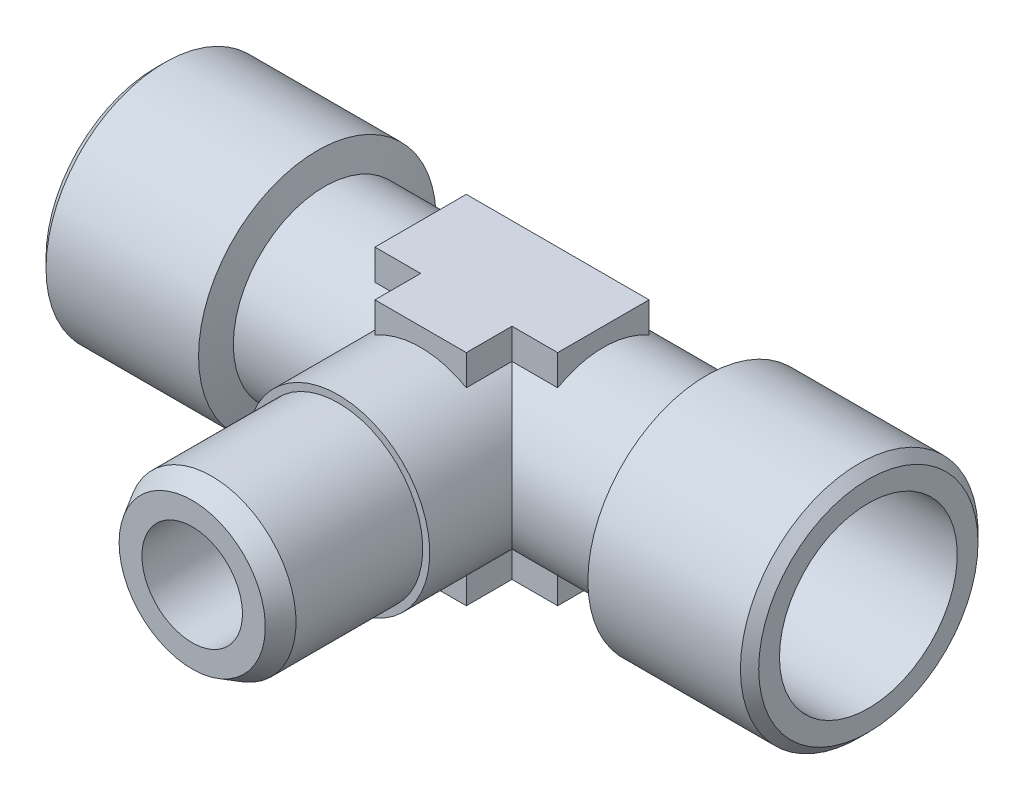
ISO-10303-21;
HEADER;
FILE_DESCRIPTION(('STEP AP214'),'2;1');
FILE_NAME('part.step','',(''),(''),'','','');
FILE_SCHEMA(('AUTOMOTIVE_DESIGN { 1 0 10303 214 1 1 1 1 }'));
ENDSEC;
DATA;
#1=APPLICATION_CONTEXT('core data for automotive mechanical design processes');
#2=APPLICATION_PROTOCOL_DEFINITION('international standard','automotive_design',2000,#1);
#3=PRODUCT_CONTEXT('',#1,'mechanical');
#4=PRODUCT('Part','Part','',(#3));
#5=PRODUCT_RELATED_PRODUCT_CATEGORY('part','',(#4));
#6=PRODUCT_DEFINITION_FORMATION('','',#4);
#7=PRODUCT_DEFINITION_CONTEXT('part definition',#1,'design');
#8=PRODUCT_DEFINITION('design','',#6,#7);
#9=PRODUCT_DEFINITION_SHAPE('','',#8);
#10=(LENGTH_UNIT() NAMED_UNIT(*) SI_UNIT(.MILLI.,.METRE.));
#11=(NAMED_UNIT(*) PLANE_ANGLE_UNIT() SI_UNIT($,.RADIAN.));
#12=(NAMED_UNIT(*) SI_UNIT($,.STERADIAN.) SOLID_ANGLE_UNIT());
#13=UNCERTAINTY_MEASURE_WITH_UNIT(LENGTH_MEASURE(1.E-05),#10,'distance_accuracy_value','');
#14=(GEOMETRIC_REPRESENTATION_CONTEXT(3) GLOBAL_UNCERTAINTY_ASSIGNED_CONTEXT((#13)) GLOBAL_UNIT_ASSIGNED_CONTEXT((#10,
#11,#12)) REPRESENTATION_CONTEXT('',''));
#15=CARTESIAN_POINT('',(0.,0.,0.));
#16=DIRECTION('',(0.,0.,1.));
#17=DIRECTION('',(1.,0.,0.));
#18=AXIS2_PLACEMENT_3D('',#15,#16,#17);
#19=CARTESIAN_POINT('',(-19.5,0.,-5.99999999999999));
#20=DIRECTION('',(1.,0.,0.));
#21=DIRECTION('',(0.,0.,-1.));
#22=AXIS2_PLACEMENT_3D('',#19,#20,#21);
#23=PLANE('',#22);
#24=CARTESIAN_POINT('',(-19.5,0.,0.));
#25=DIRECTION('',(-1.,0.,0.));
#26=DIRECTION('',(0.,0.,1.));
#27=AXIS2_PLACEMENT_3D('',#24,#25,#26);
#28=CIRCLE('',#27,5.99999999999999);
#29=CARTESIAN_POINT('',(-19.5,0.,5.99999999999999));
#30=VERTEX_POINT('',#29);
#31=EDGE_CURVE('E201',#30,#30,#28,.T.);
#32=ORIENTED_EDGE('',*,*,#31,.T.);
#33=EDGE_LOOP('',(#32));
#34=FACE_BOUND('',#33,.T.);
#35=CARTESIAN_POINT('',(-19.5,0.,0.));
#36=DIRECTION('',(-1.,0.,0.));
#37=DIRECTION('',(0.,0.,1.));
#38=AXIS2_PLACEMENT_3D('',#35,#36,#37);
#39=CIRCLE('',#38,4.865);
#40=CARTESIAN_POINT('',(-19.5,0.,4.865));
#41=VERTEX_POINT('',#40);
#42=EDGE_CURVE('E321',#41,#41,#39,.T.);
#43=ORIENTED_EDGE('',*,*,#42,.F.);
#44=EDGE_LOOP('',(#43));
#45=FACE_BOUND('',#44,.T.);
#46=ADVANCED_FACE('F16',(#34,#45),#23,.F.);
#47=CARTESIAN_POINT('',(19.5,0.,-6.));
#48=DIRECTION('',(-1.,0.,0.));
#49=DIRECTION('',(0.,0.,1.));
#50=AXIS2_PLACEMENT_3D('',#47,#48,#49);
#51=PLANE('',#50);
#52=CARTESIAN_POINT('',(19.5,0.,0.));
#53=DIRECTION('',(-1.,0.,0.));
#54=DIRECTION('',(0.,0.,1.));
#55=AXIS2_PLACEMENT_3D('',#52,#53,#54);
#56=CIRCLE('',#55,6.);
#57=CARTESIAN_POINT('',(19.5,0.,6.));
#58=VERTEX_POINT('',#57);
#59=EDGE_CURVE('E198',#58,#58,#56,.T.);
#60=ORIENTED_EDGE('',*,*,#59,.F.);
#61=EDGE_LOOP('',(#60));
#62=FACE_BOUND('',#61,.T.);
#63=CARTESIAN_POINT('',(19.5,0.,0.));
#64=DIRECTION('',(-1.,0.,0.));
#65=DIRECTION('',(0.,0.,1.));
#66=AXIS2_PLACEMENT_3D('',#63,#64,#65);
#67=CIRCLE('',#66,4.865);
#68=CARTESIAN_POINT('',(19.5,0.,4.865));
#69=VERTEX_POINT('',#68);
#70=EDGE_CURVE('E348',#69,#69,#67,.T.);
#71=ORIENTED_EDGE('',*,*,#70,.T.);
#72=EDGE_LOOP('',(#71));
#73=FACE_BOUND('',#72,.T.);
#74=ADVANCED_FACE('F381',(#62,#73),#51,.F.);
#75=CARTESIAN_POINT('',(0.,0.,0.));
#76=DIRECTION('',(-1.,0.,0.));
#77=DIRECTION('',(0.,0.,1.));
#78=AXIS2_PLACEMENT_3D('',#75,#76,#77);
#79=CYLINDRICAL_SURFACE('',#78,5.);
#80=CARTESIAN_POINT('',(-10.25,0.,0.));
#81=DIRECTION('',(-1.,0.,0.));
#82=DIRECTION('',(0.,0.,1.));
#83=AXIS2_PLACEMENT_3D('',#80,#81,#82);
#84=CIRCLE('',#83,5.);
#85=CARTESIAN_POINT('',(-10.25,0.,5.));
#86=VERTEX_POINT('',#85);
#87=EDGE_CURVE('E186',#86,#86,#84,.T.);
#88=ORIENTED_EDGE('',*,*,#87,.F.);
#89=EDGE_LOOP('',(#88));
#90=FACE_BOUND('',#89,.T.);
#91=CARTESIAN_POINT('',(10.25,0.,0.));
#92=DIRECTION('',(-1.,0.,0.));
#93=DIRECTION('',(0.,0.,1.));
#94=AXIS2_PLACEMENT_3D('',#91,#92,#93);
#95=CIRCLE('',#94,5.);
#96=CARTESIAN_POINT('',(10.25,0.,5.));
#97=VERTEX_POINT('',#96);
#98=EDGE_CURVE('E189',#97,#97,#95,.T.);
#99=ORIENTED_EDGE('',*,*,#98,.T.);
#100=EDGE_LOOP('',(#99));
#101=FACE_BOUND('',#100,.T.);
#102=DIRECTION('',(-1.,0.,0.));
#103=VECTOR('',#102,1.);
#104=CARTESIAN_POINT('',(0.,-4.33012701892219,2.5));
#105=LINE('',#104,#103);
#106=CARTESIAN_POINT('',(-2.5,-4.33012701892219,2.5));
#107=VERTEX_POINT('',#106);
#108=CARTESIAN_POINT('',(-5.,-4.33012701892219,2.5));
#109=VERTEX_POINT('',#108);
#110=EDGE_CURVE('E172',#107,#109,#105,.T.);
#111=ORIENTED_EDGE('',*,*,#110,.F.);
#112=CARTESIAN_POINT('',(0.,0.,0.));
#113=DIRECTION('',(-0.707106781186547,0.,-0.707106781186547));
#114=DIRECTION('',(-0.707106781186547,0.,0.707106781186547));
#115=AXIS2_PLACEMENT_3D('',#112,#113,#114);
#116=ELLIPSE('',#115,7.07106781186547,5.);
#117=CARTESIAN_POINT('',(-2.5,4.33012701892219,2.5));
#118=VERTEX_POINT('',#117);
#119=EDGE_CURVE('E213',#107,#118,#116,.T.);
#120=ORIENTED_EDGE('',*,*,#119,.T.);
#121=DIRECTION('',(-1.,0.,0.));
#122=VECTOR('',#121,1.);
#123=CARTESIAN_POINT('',(0.,4.33012701892219,2.5));
#124=LINE('',#123,#122);
#125=CARTESIAN_POINT('',(-5.,4.33012701892219,2.5));
#126=VERTEX_POINT('',#125);
#127=EDGE_CURVE('E170',#126,#118,#124,.F.);
#128=ORIENTED_EDGE('',*,*,#127,.F.);
#129=CARTESIAN_POINT('',(-5.,0.,0.));
#130=DIRECTION('',(1.,0.,0.));
#131=DIRECTION('',(0.,0.,-1.));
#132=AXIS2_PLACEMENT_3D('',#129,#130,#131);
#133=CIRCLE('',#132,5.);
#134=CARTESIAN_POINT('',(-5.,4.33012701892219,-2.5));
#135=VERTEX_POINT('',#134);
#136=EDGE_CURVE('E31',#135,#126,#133,.T.);
#137=ORIENTED_EDGE('',*,*,#136,.F.);
#138=DIRECTION('',(-1.,0.,0.));
#139=VECTOR('',#138,1.);
#140=CARTESIAN_POINT('',(0.,4.33012701892219,-2.5));
#141=LINE('',#140,#139);
#142=CARTESIAN_POINT('',(5.,4.33012701892219,-2.5));
#143=VERTEX_POINT('',#142);
#144=EDGE_CURVE('E233',#143,#135,#141,.T.);
#145=ORIENTED_EDGE('',*,*,#144,.F.);
#146=CARTESIAN_POINT('',(5.,0.,0.));
#147=DIRECTION('',(-1.,0.,0.));
#148=DIRECTION('',(0.,0.,1.));
#149=AXIS2_PLACEMENT_3D('',#146,#147,#148);
#150=CIRCLE('',#149,5.);
#151=CARTESIAN_POINT('',(5.,4.33012701892219,2.5));
#152=VERTEX_POINT('',#151);
#153=EDGE_CURVE('E160',#152,#143,#150,.T.);
#154=ORIENTED_EDGE('',*,*,#153,.F.);
#155=DIRECTION('',(-1.,0.,0.));
#156=VECTOR('',#155,1.);
#157=CARTESIAN_POINT('',(0.,4.33012701892219,2.5));
#158=LINE('',#157,#156);
#159=CARTESIAN_POINT('',(2.5,4.33012701892219,2.5));
#160=VERTEX_POINT('',#159);
#161=EDGE_CURVE('E161',#160,#152,#158,.F.);
#162=ORIENTED_EDGE('',*,*,#161,.F.);
#163=CARTESIAN_POINT('',(0.,0.,0.));
#164=DIRECTION('',(-0.707106781186547,0.,0.707106781186547));
#165=DIRECTION('',(-0.707106781186547,0.,-0.707106781186547));
#166=AXIS2_PLACEMENT_3D('',#163,#164,#165);
#167=ELLIPSE('',#166,7.07106781186547,5.);
#168=CARTESIAN_POINT('',(2.5,-4.33012701892219,2.5));
#169=VERTEX_POINT('',#168);
#170=EDGE_CURVE('E210',#160,#169,#167,.F.);
#171=ORIENTED_EDGE('',*,*,#170,.T.);
#172=DIRECTION('',(-1.,0.,0.));
#173=VECTOR('',#172,1.);
#174=CARTESIAN_POINT('',(0.,-4.33012701892219,2.5));
#175=LINE('',#174,#173);
#176=CARTESIAN_POINT('',(5.,-4.33012701892219,2.5));
#177=VERTEX_POINT('',#176);
#178=EDGE_CURVE('E164',#177,#169,#175,.T.);
#179=ORIENTED_EDGE('',*,*,#178,.F.);
#180=CARTESIAN_POINT('',(5.,-4.33012701892219,-2.5));
#181=VERTEX_POINT('',#180);
#182=EDGE_CURVE('E234',#181,#177,#150,.T.);
#183=ORIENTED_EDGE('',*,*,#182,.F.);
#184=DIRECTION('',(-1.,0.,0.));
#185=VECTOR('',#184,1.);
#186=CARTESIAN_POINT('',(0.,-4.33012701892219,-2.5));
#187=LINE('',#186,#185);
#188=CARTESIAN_POINT('',(-5.,-4.33012701892219,-2.5));
#189=VERTEX_POINT('',#188);
#190=EDGE_CURVE('E29',#189,#181,#187,.F.);
#191=ORIENTED_EDGE('',*,*,#190,.F.);
#192=EDGE_CURVE('E10',#109,#189,#133,.T.);
#193=ORIENTED_EDGE('',*,*,#192,.F.);
#194=EDGE_LOOP('',(#111,#120,#128,#137,#145,#154,#162,#171,#179,#183,#191,#193));
#195=FACE_BOUND('',#194,.T.);
#196=ADVANCED_FACE('F255',(#90,#101,#195),#79,.T.);
#197=CARTESIAN_POINT('',(0.,0.,0.));
#198=DIRECTION('',(0.,0.,-1.));
#199=DIRECTION('',(-1.,0.,0.));
#200=AXIS2_PLACEMENT_3D('',#197,#198,#199);
#201=CYLINDRICAL_SURFACE('',#200,5.);
#202=CARTESIAN_POINT('',(0.,0.,9.5));
#203=DIRECTION('',(0.,0.,-1.));
#204=DIRECTION('',(-1.,0.,0.));
#205=AXIS2_PLACEMENT_3D('',#202,#203,#204);
#206=CIRCLE('',#205,5.);
#207=CARTESIAN_POINT('',(-5.,0.,9.5));
#208=VERTEX_POINT('',#207);
#209=EDGE_CURVE('E183',#208,#208,#206,.T.);
#210=ORIENTED_EDGE('',*,*,#209,.T.);
#211=EDGE_LOOP('',(#210));
#212=FACE_BOUND('',#211,.T.);
#213=CARTESIAN_POINT('',(0.,0.,5.));
#214=DIRECTION('',(0.,0.,-1.));
#215=DIRECTION('',(-1.,0.,0.));
#216=AXIS2_PLACEMENT_3D('',#213,#214,#215);
#217=CIRCLE('',#216,5.);
#218=CARTESIAN_POINT('',(2.5,4.33012701892219,5.));
#219=VERTEX_POINT('',#218);
#220=CARTESIAN_POINT('',(-2.5,4.33012701892219,5.));
#221=VERTEX_POINT('',#220);
#222=EDGE_CURVE('E223',#219,#221,#217,.F.);
#223=ORIENTED_EDGE('',*,*,#222,.T.);
#224=DIRECTION('',(0.,0.,-1.));
#225=VECTOR('',#224,1.);
#226=CARTESIAN_POINT('',(-2.5,4.33012701892219,0.));
#227=LINE('',#226,#225);
#228=EDGE_CURVE('E229',#221,#118,#227,.T.);
#229=ORIENTED_EDGE('',*,*,#228,.T.);
#230=ORIENTED_EDGE('',*,*,#119,.F.);
#231=DIRECTION('',(0.,0.,-1.));
#232=VECTOR('',#231,1.);
#233=CARTESIAN_POINT('',(-2.5,-4.33012701892219,0.));
#234=LINE('',#233,#232);
#235=CARTESIAN_POINT('',(-2.5,-4.33012701892219,5.));
#236=VERTEX_POINT('',#235);
#237=EDGE_CURVE('E222',#107,#236,#234,.F.);
#238=ORIENTED_EDGE('',*,*,#237,.T.);
#239=CARTESIAN_POINT('',(2.5,-4.33012701892219,5.));
#240=VERTEX_POINT('',#239);
#241=EDGE_CURVE('E219',#236,#240,#217,.F.);
#242=ORIENTED_EDGE('',*,*,#241,.T.);
#243=DIRECTION('',(0.,0.,-1.));
#244=VECTOR('',#243,1.);
#245=CARTESIAN_POINT('',(2.5,-4.33012701892219,0.));
#246=LINE('',#245,#244);
#247=EDGE_CURVE('E216',#240,#169,#246,.T.);
#248=ORIENTED_EDGE('',*,*,#247,.T.);
#249=ORIENTED_EDGE('',*,*,#170,.F.);
#250=DIRECTION('',(0.,0.,-1.));
#251=VECTOR('',#250,1.);
#252=CARTESIAN_POINT('',(2.5,4.33012701892219,0.));
#253=LINE('',#252,#251);
#254=EDGE_CURVE('E226',#160,#219,#253,.F.);
#255=ORIENTED_EDGE('',*,*,#254,.T.);
#256=EDGE_LOOP('',(#223,#229,#230,#238,#242,#248,#249,#255));
#257=FACE_BOUND('',#256,.T.);
#258=ADVANCED_FACE('F260',(#212,#257),#201,.T.);
#259=CARTESIAN_POINT('',(-10.25,0.,0.));
#260=DIRECTION('',(-1.,0.,0.));
#261=DIRECTION('',(0.,0.,1.));
#262=AXIS2_PLACEMENT_3D('',#259,#260,#261);
#263=CONICAL_SURFACE('',#262,5.,1.30899693899576);
#264=CARTESIAN_POINT('',(-10.6519237886467,0.,0.));
#265=DIRECTION('',(-1.,0.,0.));
#266=DIRECTION('',(0.,0.,1.));
#267=AXIS2_PLACEMENT_3D('',#264,#265,#266);
#268=CIRCLE('',#267,6.5);
#269=CARTESIAN_POINT('',(-10.6519237886467,0.,6.5));
#270=VERTEX_POINT('',#269);
#271=EDGE_CURVE('E207',#270,#270,#268,.T.);
#272=ORIENTED_EDGE('',*,*,#271,.F.);
#273=EDGE_LOOP('',(#272));
#274=FACE_BOUND('',#273,.T.);
#275=ORIENTED_EDGE('',*,*,#87,.T.);
#276=EDGE_LOOP('',(#275));
#277=FACE_BOUND('',#276,.T.);
#278=ADVANCED_FACE('F18',(#274,#277),#263,.T.);
#279=CARTESIAN_POINT('',(0.,0.,0.));
#280=DIRECTION('',(-1.,0.,0.));
#281=DIRECTION('',(0.,0.,1.));
#282=AXIS2_PLACEMENT_3D('',#279,#280,#281);
#283=CYLINDRICAL_SURFACE('',#282,6.5);
#284=CARTESIAN_POINT('',(-19.,0.,0.));
#285=DIRECTION('',(-1.,0.,0.));
#286=DIRECTION('',(0.,0.,1.));
#287=AXIS2_PLACEMENT_3D('',#284,#285,#286);
#288=CIRCLE('',#287,6.5);
#289=CARTESIAN_POINT('',(-19.,0.,6.5));
#290=VERTEX_POINT('',#289);
#291=EDGE_CURVE('E204',#290,#290,#288,.T.);
#292=ORIENTED_EDGE('',*,*,#291,.F.);
#293=EDGE_LOOP('',(#292));
#294=FACE_BOUND('',#293,.T.);
#295=ORIENTED_EDGE('',*,*,#271,.T.);
#296=EDGE_LOOP('',(#295));
#297=FACE_BOUND('',#296,.T.);
#298=ADVANCED_FACE('F401',(#294,#297),#283,.T.);
#299=CARTESIAN_POINT('',(-19.,0.,0.));
#300=DIRECTION('',(1.,0.,0.));
#301=DIRECTION('',(0.,0.,-1.));
#302=AXIS2_PLACEMENT_3D('',#299,#300,#301);
#303=CONICAL_SURFACE('',#302,6.5,0.785398163397469);
#304=ORIENTED_EDGE('',*,*,#31,.F.);
#305=EDGE_LOOP('',(#304));
#306=FACE_BOUND('',#305,.T.);
#307=ORIENTED_EDGE('',*,*,#291,.T.);
#308=EDGE_LOOP('',(#307));
#309=FACE_BOUND('',#308,.T.);
#310=ADVANCED_FACE('F399',(#306,#309),#303,.T.);
#311=CARTESIAN_POINT('',(19.5,0.,0.));
#312=DIRECTION('',(-1.,0.,0.));
#313=DIRECTION('',(0.,0.,1.));
#314=AXIS2_PLACEMENT_3D('',#311,#312,#313);
#315=CONICAL_SURFACE('',#314,6.,0.785398163397448);
#316=CARTESIAN_POINT('',(19.,0.,0.));
#317=DIRECTION('',(-1.,0.,0.));
#318=DIRECTION('',(0.,0.,1.));
#319=AXIS2_PLACEMENT_3D('',#316,#317,#318);
#320=CIRCLE('',#319,6.5);
#321=CARTESIAN_POINT('',(19.,0.,6.5));
#322=VERTEX_POINT('',#321);
#323=EDGE_CURVE('E195',#322,#322,#320,.T.);
#324=ORIENTED_EDGE('',*,*,#323,.F.);
#325=EDGE_LOOP('',(#324));
#326=FACE_BOUND('',#325,.T.);
#327=ORIENTED_EDGE('',*,*,#59,.T.);
#328=EDGE_LOOP('',(#327));
#329=FACE_BOUND('',#328,.T.);
#330=ADVANCED_FACE('F396',(#326,#329),#315,.T.);
#331=CARTESIAN_POINT('',(0.,0.,0.));
#332=DIRECTION('',(-1.,0.,0.));
#333=DIRECTION('',(0.,0.,1.));
#334=AXIS2_PLACEMENT_3D('',#331,#332,#333);
#335=CYLINDRICAL_SURFACE('',#334,6.5);
#336=CARTESIAN_POINT('',(10.6519237886467,0.,0.));
#337=DIRECTION('',(-1.,0.,0.));
#338=DIRECTION('',(0.,0.,1.));
#339=AXIS2_PLACEMENT_3D('',#336,#337,#338);
#340=CIRCLE('',#339,6.5);
#341=CARTESIAN_POINT('',(10.6519237886467,0.,6.5));
#342=VERTEX_POINT('',#341);
#343=EDGE_CURVE('E192',#342,#342,#340,.T.);
#344=ORIENTED_EDGE('',*,*,#343,.F.);
#345=EDGE_LOOP('',(#344));
#346=FACE_BOUND('',#345,.T.);
#347=ORIENTED_EDGE('',*,*,#323,.T.);
#348=EDGE_LOOP('',(#347));
#349=FACE_BOUND('',#348,.T.);
#350=ADVANCED_FACE('F421',(#346,#349),#335,.T.);
#351=CARTESIAN_POINT('',(10.6519237886467,0.,0.));
#352=DIRECTION('',(1.,0.,0.));
#353=DIRECTION('',(0.,0.,-1.));
#354=AXIS2_PLACEMENT_3D('',#351,#352,#353);
#355=CONICAL_SURFACE('',#354,6.5,1.30899693899576);
#356=ORIENTED_EDGE('',*,*,#98,.F.);
#357=EDGE_LOOP('',(#356));
#358=FACE_BOUND('',#357,.T.);
#359=ORIENTED_EDGE('',*,*,#343,.T.);
#360=EDGE_LOOP('',(#359));
#361=FACE_BOUND('',#360,.T.);
#362=ADVANCED_FACE('F417',(#358,#361),#355,.T.);
#363=CARTESIAN_POINT('',(-5.,0.,9.5));
#364=DIRECTION('',(0.,0.,1.));
#365=DIRECTION('',(1.,0.,0.));
#366=AXIS2_PLACEMENT_3D('',#363,#364,#365);
#367=PLANE('',#366);
#368=CARTESIAN_POINT('',(0.,0.,9.5));
#369=DIRECTION('',(0.,0.,-1.));
#370=DIRECTION('',(-1.,0.,0.));
#371=AXIS2_PLACEMENT_3D('',#368,#369,#370);
#372=CIRCLE('',#371,4.615);
#373=CARTESIAN_POINT('',(-4.615,0.,9.5));
#374=VERTEX_POINT('',#373);
#375=EDGE_CURVE('E180',#374,#374,#372,.T.);
#376=ORIENTED_EDGE('',*,*,#375,.T.);
#377=EDGE_LOOP('',(#376));
#378=FACE_BOUND('',#377,.T.);
#379=ORIENTED_EDGE('',*,*,#209,.F.);
#380=EDGE_LOOP('',(#379));
#381=FACE_BOUND('',#380,.T.);
#382=ADVANCED_FACE('F420',(#378,#381),#367,.T.);
#383=CARTESIAN_POINT('',(0.,0.,0.));
#384=DIRECTION('',(0.,0.,-1.));
#385=DIRECTION('',(-1.,0.,0.));
#386=AXIS2_PLACEMENT_3D('',#383,#384,#385);
#387=CYLINDRICAL_SURFACE('',#386,4.615);
#388=CARTESIAN_POINT('',(0.,0.,16.4347887533451));
#389=DIRECTION('',(0.,0.,-1.));
#390=DIRECTION('',(-1.,0.,0.));
#391=AXIS2_PLACEMENT_3D('',#388,#389,#390);
#392=CIRCLE('',#391,4.615);
#393=CARTESIAN_POINT('',(-4.615,0.,16.4347887533451));
#394=VERTEX_POINT('',#393);
#395=EDGE_CURVE('E177',#394,#394,#392,.T.);
#396=ORIENTED_EDGE('',*,*,#395,.T.);
#397=EDGE_LOOP('',(#396));
#398=FACE_BOUND('',#397,.T.);
#399=ORIENTED_EDGE('',*,*,#375,.F.);
#400=EDGE_LOOP('',(#399));
#401=FACE_BOUND('',#400,.T.);
#402=ADVANCED_FACE('F454',(#398,#401),#387,.T.);
#403=CARTESIAN_POINT('',(0.,0.,16.4347887533451));
#404=DIRECTION('',(0.,0.,-1.));
#405=DIRECTION('',(-1.,0.,0.));
#406=AXIS2_PLACEMENT_3D('',#403,#404,#405);
#407=CONICAL_SURFACE('',#406,4.615,0.523598775598296);
#408=CARTESIAN_POINT('',(0.,0.,17.5));
#409=DIRECTION('',(0.,0.,-1.));
#410=DIRECTION('',(-1.,0.,0.));
#411=AXIS2_PLACEMENT_3D('',#408,#409,#410);
#412=CIRCLE('',#411,4.);
#413=CARTESIAN_POINT('',(-4.,0.,17.5));
#414=VERTEX_POINT('',#413);
#415=EDGE_CURVE('E174',#414,#414,#412,.T.);
#416=ORIENTED_EDGE('',*,*,#415,.T.);
#417=EDGE_LOOP('',(#416));
#418=FACE_BOUND('',#417,.T.);
#419=ORIENTED_EDGE('',*,*,#395,.F.);
#420=EDGE_LOOP('',(#419));
#421=FACE_BOUND('',#420,.T.);
#422=ADVANCED_FACE('F463',(#418,#421),#407,.T.);
#423=CARTESIAN_POINT('',(-4.,0.,17.5));
#424=DIRECTION('',(0.,0.,1.));
#425=DIRECTION('',(1.,0.,0.));
#426=AXIS2_PLACEMENT_3D('',#423,#424,#425);
#427=PLANE('',#426);
#428=CARTESIAN_POINT('',(0.,0.,17.5));
#429=DIRECTION('',(0.,0.,-1.));
#430=DIRECTION('',(-1.,0.,0.));
#431=AXIS2_PLACEMENT_3D('',#428,#429,#430);
#432=CIRCLE('',#431,2.75);
#433=CARTESIAN_POINT('',(-2.75,0.,17.5));
#434=VERTEX_POINT('',#433);
#435=EDGE_CURVE('E351',#434,#434,#432,.T.);
#436=ORIENTED_EDGE('',*,*,#435,.T.);
#437=EDGE_LOOP('',(#436));
#438=FACE_BOUND('',#437,.T.);
#439=ORIENTED_EDGE('',*,*,#415,.F.);
#440=EDGE_LOOP('',(#439));
#441=FACE_BOUND('',#440,.T.);
#442=ADVANCED_FACE('F472',(#438,#441),#427,.T.);
#443=CARTESIAN_POINT('',(5.,-6.,2.5));
#444=DIRECTION('',(0.,-1.,0.));
#445=DIRECTION('',(0.,0.,-1.));
#446=AXIS2_PLACEMENT_3D('',#443,#444,#445);
#447=PLANE('',#446);
#448=DIRECTION('',(0.,0.,-1.));
#449=VECTOR('',#448,1.);
#450=CARTESIAN_POINT('',(5.,-6.,2.5));
#451=LINE('',#450,#449);
#452=CARTESIAN_POINT('',(5.,-6.,2.5));
#453=VERTEX_POINT('',#452);
#454=CARTESIAN_POINT('',(5.,-6.,-2.5));
#455=VERTEX_POINT('',#454);
#456=EDGE_CURVE('E320',#453,#455,#451,.T.);
#457=ORIENTED_EDGE('',*,*,#456,.F.);
#458=DIRECTION('',(1.,0.,0.));
#459=VECTOR('',#458,1.);
#460=CARTESIAN_POINT('',(2.5,-6.,2.5));
#461=LINE('',#460,#459);
#462=CARTESIAN_POINT('',(2.5,-6.,2.5));
#463=VERTEX_POINT('',#462);
#464=EDGE_CURVE('E156',#463,#453,#461,.T.);
#465=ORIENTED_EDGE('',*,*,#464,.F.);
#466=DIRECTION('',(0.,0.,-1.));
#467=VECTOR('',#466,1.);
#468=CARTESIAN_POINT('',(2.5,-6.,5.));
#469=LINE('',#468,#467);
#470=CARTESIAN_POINT('',(2.5,-6.,5.));
#471=VERTEX_POINT('',#470);
#472=EDGE_CURVE('E318',#471,#463,#469,.T.);
#473=ORIENTED_EDGE('',*,*,#472,.F.);
#474=DIRECTION('',(1.,0.,0.));
#475=VECTOR('',#474,1.);
#476=CARTESIAN_POINT('',(-2.5,-6.,5.));
#477=LINE('',#476,#475);
#478=CARTESIAN_POINT('',(-2.5,-6.,5.));
#479=VERTEX_POINT('',#478);
#480=EDGE_CURVE('E269',#479,#471,#477,.T.);
#481=ORIENTED_EDGE('',*,*,#480,.F.);
#482=DIRECTION('',(0.,0.,1.));
#483=VECTOR('',#482,1.);
#484=CARTESIAN_POINT('',(-2.5,-6.,2.5));
#485=LINE('',#484,#483);
#486=CARTESIAN_POINT('',(-2.5,-6.,2.5));
#487=VERTEX_POINT('',#486);
#488=EDGE_CURVE('E312',#487,#479,#485,.T.);
#489=ORIENTED_EDGE('',*,*,#488,.F.);
#490=DIRECTION('',(1.,0.,0.));
#491=VECTOR('',#490,1.);
#492=CARTESIAN_POINT('',(-5.,-6.,2.5));
#493=LINE('',#492,#491);
#494=CARTESIAN_POINT('',(-5.,-6.,2.5));
#495=VERTEX_POINT('',#494);
#496=EDGE_CURVE('E298',#495,#487,#493,.T.);
#497=ORIENTED_EDGE('',*,*,#496,.F.);
#498=DIRECTION('',(0.,0.,1.));
#499=VECTOR('',#498,1.);
#500=CARTESIAN_POINT('',(-5.,-6.,-2.5));
#501=LINE('',#500,#499);
#502=CARTESIAN_POINT('',(-5.,-6.,-2.5));
#503=VERTEX_POINT('',#502);
#504=EDGE_CURVE('E303',#503,#495,#501,.T.);
#505=ORIENTED_EDGE('',*,*,#504,.F.);
#506=DIRECTION('',(-1.,0.,0.));
#507=VECTOR('',#506,1.);
#508=CARTESIAN_POINT('',(5.,-6.,-2.5));
#509=LINE('',#508,#507);
#510=EDGE_CURVE('E308',#455,#503,#509,.T.);
#511=ORIENTED_EDGE('',*,*,#510,.F.);
#512=EDGE_LOOP('',(#457,#465,#473,#481,#489,#497,#505,#511));
#513=FACE_BOUND('',#512,.T.);
#514=ADVANCED_FACE('F310',(#513),#447,.T.);
#515=CARTESIAN_POINT('',(2.5,6.,5.));
#516=DIRECTION('',(-1.,0.,0.));
#517=DIRECTION('',(0.,0.,1.));
#518=AXIS2_PLACEMENT_3D('',#515,#516,#517);
#519=PLANE('',#518);
#520=ORIENTED_EDGE('',*,*,#247,.F.);
#521=DIRECTION('',(0.,-1.,0.));
#522=VECTOR('',#521,1.);
#523=CARTESIAN_POINT('',(2.5,6.,5.));
#524=LINE('',#523,#522);
#525=EDGE_CURVE('E263',#240,#471,#524,.T.);
#526=ORIENTED_EDGE('',*,*,#525,.T.);
#527=ORIENTED_EDGE('',*,*,#472,.T.);
#528=DIRECTION('',(0.,-1.,0.));
#529=VECTOR('',#528,1.);
#530=CARTESIAN_POINT('',(2.5,6.,2.5));
#531=LINE('',#530,#529);
#532=EDGE_CURVE('E46',#169,#463,#531,.T.);
#533=ORIENTED_EDGE('',*,*,#532,.F.);
#534=EDGE_LOOP('',(#520,#526,#527,#533));
#535=FACE_BOUND('',#534,.T.);
#536=ADVANCED_FACE('F262',(#535),#519,.F.);
#537=CARTESIAN_POINT('',(-2.5,6.,5.));
#538=DIRECTION('',(0.,0.,-1.));
#539=DIRECTION('',(-1.,0.,0.));
#540=AXIS2_PLACEMENT_3D('',#537,#538,#539);
#541=PLANE('',#540);
#542=ORIENTED_EDGE('',*,*,#241,.F.);
#543=DIRECTION('',(0.,-1.,0.));
#544=VECTOR('',#543,1.);
#545=CARTESIAN_POINT('',(-2.5,6.,5.));
#546=LINE('',#545,#544);
#547=EDGE_CURVE('E273',#236,#479,#546,.T.);
#548=ORIENTED_EDGE('',*,*,#547,.T.);
#549=ORIENTED_EDGE('',*,*,#480,.T.);
#550=ORIENTED_EDGE('',*,*,#525,.F.);
#551=EDGE_LOOP('',(#542,#548,#549,#550));
#552=FACE_BOUND('',#551,.T.);
#553=ADVANCED_FACE('F266',(#552),#541,.F.);
#554=CARTESIAN_POINT('',(-2.5,6.,2.5));
#555=DIRECTION('',(1.,0.,0.));
#556=DIRECTION('',(0.,0.,-1.));
#557=AXIS2_PLACEMENT_3D('',#554,#555,#556);
#558=PLANE('',#557);
#559=ORIENTED_EDGE('',*,*,#237,.F.);
#560=DIRECTION('',(0.,-1.,0.));
#561=VECTOR('',#560,1.);
#562=CARTESIAN_POINT('',(-2.5,6.,2.5));
#563=LINE('',#562,#561);
#564=EDGE_CURVE('E280',#107,#487,#563,.T.);
#565=ORIENTED_EDGE('',*,*,#564,.T.);
#566=ORIENTED_EDGE('',*,*,#488,.T.);
#567=ORIENTED_EDGE('',*,*,#547,.F.);
#568=EDGE_LOOP('',(#559,#565,#566,#567));
#569=FACE_BOUND('',#568,.T.);
#570=ADVANCED_FACE('F503',(#569),#558,.F.);
#571=CARTESIAN_POINT('',(2.5,6.,2.5));
#572=DIRECTION('',(0.,0.,-1.));
#573=DIRECTION('',(-1.,0.,0.));
#574=AXIS2_PLACEMENT_3D('',#571,#572,#573);
#575=PLANE('',#574);
#576=DIRECTION('',(0.,-1.,0.));
#577=VECTOR('',#576,1.);
#578=CARTESIAN_POINT('',(5.,6.,2.5));
#579=LINE('',#578,#577);
#580=EDGE_CURVE('E244',#177,#453,#579,.T.);
#581=ORIENTED_EDGE('',*,*,#580,.F.);
#582=ORIENTED_EDGE('',*,*,#178,.T.);
#583=ORIENTED_EDGE('',*,*,#532,.T.);
#584=ORIENTED_EDGE('',*,*,#464,.T.);
#585=EDGE_LOOP('',(#581,#582,#583,#584));
#586=FACE_BOUND('',#585,.T.);
#587=ADVANCED_FACE('F249',(#586),#575,.F.);
#588=CARTESIAN_POINT('',(-5.,6.,2.5));
#589=DIRECTION('',(0.,0.,-1.));
#590=DIRECTION('',(-1.,0.,0.));
#591=AXIS2_PLACEMENT_3D('',#588,#589,#590);
#592=PLANE('',#591);
#593=ORIENTED_EDGE('',*,*,#564,.F.);
#594=ORIENTED_EDGE('',*,*,#110,.T.);
#595=DIRECTION('',(0.,-1.,0.));
#596=VECTOR('',#595,1.);
#597=CARTESIAN_POINT('',(-5.,6.,2.5));
#598=LINE('',#597,#596);
#599=EDGE_CURVE('E283',#109,#495,#598,.T.);
#600=ORIENTED_EDGE('',*,*,#599,.T.);
#601=ORIENTED_EDGE('',*,*,#496,.T.);
#602=EDGE_LOOP('',(#593,#594,#600,#601));
#603=FACE_BOUND('',#602,.T.);
#604=ADVANCED_FACE('F296',(#603),#592,.F.);
#605=CARTESIAN_POINT('',(-5.,6.,-2.5));
#606=DIRECTION('',(1.,0.,0.));
#607=DIRECTION('',(0.,0.,-1.));
#608=AXIS2_PLACEMENT_3D('',#605,#606,#607);
#609=PLANE('',#608);
#610=ORIENTED_EDGE('',*,*,#599,.F.);
#611=ORIENTED_EDGE('',*,*,#192,.T.);
#612=DIRECTION('',(0.,-1.,0.));
#613=VECTOR('',#612,1.);
#614=CARTESIAN_POINT('',(-5.,6.,-2.5));
#615=LINE('',#614,#613);
#616=EDGE_CURVE('E286',#189,#503,#615,.T.);
#617=ORIENTED_EDGE('',*,*,#616,.T.);
#618=ORIENTED_EDGE('',*,*,#504,.T.);
#619=EDGE_LOOP('',(#610,#611,#617,#618));
#620=FACE_BOUND('',#619,.T.);
#621=ADVANCED_FACE('F304',(#620),#609,.F.);
#622=CARTESIAN_POINT('',(5.,6.,-2.5));
#623=DIRECTION('',(0.,0.,1.));
#624=DIRECTION('',(1.,0.,0.));
#625=AXIS2_PLACEMENT_3D('',#622,#623,#624);
#626=PLANE('',#625);
#627=ORIENTED_EDGE('',*,*,#616,.F.);
#628=ORIENTED_EDGE('',*,*,#190,.T.);
#629=DIRECTION('',(0.,-1.,0.));
#630=VECTOR('',#629,1.);
#631=CARTESIAN_POINT('',(5.,6.,-2.5));
#632=LINE('',#631,#630);
#633=EDGE_CURVE('E162',#181,#455,#632,.T.);
#634=ORIENTED_EDGE('',*,*,#633,.T.);
#635=ORIENTED_EDGE('',*,*,#510,.T.);
#636=EDGE_LOOP('',(#627,#628,#634,#635));
#637=FACE_BOUND('',#636,.T.);
#638=ADVANCED_FACE('F537',(#637),#626,.F.);
#639=CARTESIAN_POINT('',(5.,6.,2.5));
#640=DIRECTION('',(-1.,0.,0.));
#641=DIRECTION('',(0.,0.,1.));
#642=AXIS2_PLACEMENT_3D('',#639,#640,#641);
#643=PLANE('',#642);
#644=ORIENTED_EDGE('',*,*,#633,.F.);
#645=ORIENTED_EDGE('',*,*,#182,.T.);
#646=ORIENTED_EDGE('',*,*,#580,.T.);
#647=ORIENTED_EDGE('',*,*,#456,.T.);
#648=EDGE_LOOP('',(#644,#645,#646,#647));
#649=FACE_BOUND('',#648,.T.);
#650=ADVANCED_FACE('F242',(#649),#643,.F.);
#651=CARTESIAN_POINT('',(5.,6.,2.5));
#652=VERTEX_POINT('',#651);
#653=EDGE_CURVE('E252',#652,#152,#579,.T.);
#654=ORIENTED_EDGE('',*,*,#653,.T.);
#655=ORIENTED_EDGE('',*,*,#153,.T.);
#656=CARTESIAN_POINT('',(5.,6.,-2.5));
#657=VERTEX_POINT('',#656);
#658=EDGE_CURVE('E140',#657,#143,#632,.T.);
#659=ORIENTED_EDGE('',*,*,#658,.F.);
#660=DIRECTION('',(0.,0.,-1.));
#661=VECTOR('',#660,1.);
#662=CARTESIAN_POINT('',(5.,6.,2.5));
#663=LINE('',#662,#661);
#664=EDGE_CURVE('E147',#652,#657,#663,.T.);
#665=ORIENTED_EDGE('',*,*,#664,.F.);
#666=EDGE_LOOP('',(#654,#655,#659,#665));
#667=FACE_BOUND('',#666,.T.);
#668=ADVANCED_FACE('F158',(#667),#643,.F.);
#669=ORIENTED_EDGE('',*,*,#658,.T.);
#670=ORIENTED_EDGE('',*,*,#144,.T.);
#671=CARTESIAN_POINT('',(-5.,6.,-2.5));
#672=VERTEX_POINT('',#671);
#673=EDGE_CURVE('E143',#672,#135,#615,.T.);
#674=ORIENTED_EDGE('',*,*,#673,.F.);
#675=DIRECTION('',(-1.,0.,0.));
#676=VECTOR('',#675,1.);
#677=CARTESIAN_POINT('',(5.,6.,-2.5));
#678=LINE('',#677,#676);
#679=EDGE_CURVE('E136',#657,#672,#678,.T.);
#680=ORIENTED_EDGE('',*,*,#679,.F.);
#681=EDGE_LOOP('',(#669,#670,#674,#680));
#682=FACE_BOUND('',#681,.T.);
#683=ADVANCED_FACE('F138',(#682),#626,.F.);
#684=ORIENTED_EDGE('',*,*,#673,.T.);
#685=ORIENTED_EDGE('',*,*,#136,.T.);
#686=CARTESIAN_POINT('',(-5.,6.,2.5));
#687=VERTEX_POINT('',#686);
#688=EDGE_CURVE('E284',#687,#126,#598,.T.);
#689=ORIENTED_EDGE('',*,*,#688,.F.);
#690=DIRECTION('',(0.,0.,1.));
#691=VECTOR('',#690,1.);
#692=CARTESIAN_POINT('',(-5.,6.,-2.5));
#693=LINE('',#692,#691);
#694=EDGE_CURVE('E146',#672,#687,#693,.T.);
#695=ORIENTED_EDGE('',*,*,#694,.F.);
#696=EDGE_LOOP('',(#684,#685,#689,#695));
#697=FACE_BOUND('',#696,.T.);
#698=ADVANCED_FACE('F539',(#697),#609,.F.);
#699=ORIENTED_EDGE('',*,*,#688,.T.);
#700=ORIENTED_EDGE('',*,*,#127,.T.);
#701=CARTESIAN_POINT('',(-2.5,6.,2.5));
#702=VERTEX_POINT('',#701);
#703=EDGE_CURVE('E281',#702,#118,#563,.T.);
#704=ORIENTED_EDGE('',*,*,#703,.F.);
#705=DIRECTION('',(1.,0.,0.));
#706=VECTOR('',#705,1.);
#707=CARTESIAN_POINT('',(-5.,6.,2.5));
#708=LINE('',#707,#706);
#709=EDGE_CURVE('E334',#687,#702,#708,.T.);
#710=ORIENTED_EDGE('',*,*,#709,.F.);
#711=EDGE_LOOP('',(#699,#700,#704,#710));
#712=FACE_BOUND('',#711,.T.);
#713=ADVANCED_FACE('F530',(#712),#592,.F.);
#714=ORIENTED_EDGE('',*,*,#254,.F.);
#715=CARTESIAN_POINT('',(2.5,6.,2.5));
#716=VERTEX_POINT('',#715);
#717=EDGE_CURVE('E271',#716,#160,#531,.T.);
#718=ORIENTED_EDGE('',*,*,#717,.F.);
#719=DIRECTION('',(0.,0.,-1.));
#720=VECTOR('',#719,1.);
#721=CARTESIAN_POINT('',(2.5,6.,5.));
#722=LINE('',#721,#720);
#723=CARTESIAN_POINT('',(2.5,6.,5.));
#724=VERTEX_POINT('',#723);
#725=EDGE_CURVE('E328',#724,#716,#722,.T.);
#726=ORIENTED_EDGE('',*,*,#725,.F.);
#727=EDGE_CURVE('E38',#724,#219,#524,.T.);
#728=ORIENTED_EDGE('',*,*,#727,.T.);
#729=EDGE_LOOP('',(#714,#718,#726,#728));
#730=FACE_BOUND('',#729,.T.);
#731=ADVANCED_FACE('F496',(#730),#519,.F.);
#732=ORIENTED_EDGE('',*,*,#717,.T.);
#733=ORIENTED_EDGE('',*,*,#161,.T.);
#734=ORIENTED_EDGE('',*,*,#653,.F.);
#735=DIRECTION('',(1.,0.,0.));
#736=VECTOR('',#735,1.);
#737=CARTESIAN_POINT('',(2.5,6.,2.5));
#738=LINE('',#737,#736);
#739=EDGE_CURVE('E152',#716,#652,#738,.T.);
#740=ORIENTED_EDGE('',*,*,#739,.F.);
#741=EDGE_LOOP('',(#732,#733,#734,#740));
#742=FACE_BOUND('',#741,.T.);
#743=ADVANCED_FACE('F522',(#742),#575,.F.);
#744=ORIENTED_EDGE('',*,*,#228,.F.);
#745=CARTESIAN_POINT('',(-2.5,6.,5.));
#746=VERTEX_POINT('',#745);
#747=EDGE_CURVE('E277',#746,#221,#546,.T.);
#748=ORIENTED_EDGE('',*,*,#747,.F.);
#749=DIRECTION('',(0.,0.,1.));
#750=VECTOR('',#749,1.);
#751=CARTESIAN_POINT('',(-2.5,6.,2.5));
#752=LINE('',#751,#750);
#753=EDGE_CURVE('E332',#702,#746,#752,.T.);
#754=ORIENTED_EDGE('',*,*,#753,.F.);
#755=ORIENTED_EDGE('',*,*,#703,.T.);
#756=EDGE_LOOP('',(#744,#748,#754,#755));
#757=FACE_BOUND('',#756,.T.);
#758=ADVANCED_FACE('F514',(#757),#558,.F.);
#759=ORIENTED_EDGE('',*,*,#222,.F.);
#760=ORIENTED_EDGE('',*,*,#727,.F.);
#761=DIRECTION('',(1.,0.,0.));
#762=VECTOR('',#761,1.);
#763=CARTESIAN_POINT('',(-2.5,6.,5.));
#764=LINE('',#763,#762);
#765=EDGE_CURVE('E330',#746,#724,#764,.T.);
#766=ORIENTED_EDGE('',*,*,#765,.F.);
#767=ORIENTED_EDGE('',*,*,#747,.T.);
#768=EDGE_LOOP('',(#759,#760,#766,#767));
#769=FACE_BOUND('',#768,.T.);
#770=ADVANCED_FACE('F505',(#769),#541,.F.);
#771=CARTESIAN_POINT('',(5.,6.,2.5));
#772=DIRECTION('',(0.,-1.,0.));
#773=DIRECTION('',(0.,0.,-1.));
#774=AXIS2_PLACEMENT_3D('',#771,#772,#773);
#775=PLANE('',#774);
#776=ORIENTED_EDGE('',*,*,#664,.T.);
#777=ORIENTED_EDGE('',*,*,#679,.T.);
#778=ORIENTED_EDGE('',*,*,#694,.T.);
#779=ORIENTED_EDGE('',*,*,#709,.T.);
#780=ORIENTED_EDGE('',*,*,#753,.T.);
#781=ORIENTED_EDGE('',*,*,#765,.T.);
#782=ORIENTED_EDGE('',*,*,#725,.T.);
#783=ORIENTED_EDGE('',*,*,#739,.T.);
#784=EDGE_LOOP('',(#776,#777,#778,#779,#780,#781,#782,#783));
#785=FACE_BOUND('',#784,.T.);
#786=ADVANCED_FACE('F150',(#785),#775,.F.);
#787=CARTESIAN_POINT('',(0.,0.,0.));
#788=DIRECTION('',(-1.,0.,0.));
#789=DIRECTION('',(0.,0.,1.));
#790=AXIS2_PLACEMENT_3D('',#787,#788,#789);
#791=CYLINDRICAL_SURFACE('',#790,4.865);
#792=ORIENTED_EDGE('',*,*,#42,.T.);
#793=EDGE_LOOP('',(#792));
#794=FACE_BOUND('',#793,.T.);
#795=CARTESIAN_POINT('',(-12.1,0.,0.));
#796=DIRECTION('',(-1.,0.,0.));
#797=DIRECTION('',(0.,0.,1.));
#798=AXIS2_PLACEMENT_3D('',#795,#796,#797);
#799=CIRCLE('',#798,4.865);
#800=CARTESIAN_POINT('',(-12.1,0.,4.865));
#801=VERTEX_POINT('',#800);
#802=EDGE_CURVE('E324',#801,#801,#799,.T.);
#803=ORIENTED_EDGE('',*,*,#802,.F.);
#804=EDGE_LOOP('',(#803));
#805=FACE_BOUND('',#804,.T.);
#806=ADVANCED_FACE('F612',(#794,#805),#791,.F.);
#807=CARTESIAN_POINT('',(-12.1,0.,-4.865));
#808=DIRECTION('',(-1.,0.,0.));
#809=DIRECTION('',(0.,0.,1.));
#810=AXIS2_PLACEMENT_3D('',#807,#808,#809);
#811=PLANE('',#810);
#812=ORIENTED_EDGE('',*,*,#802,.T.);
#813=EDGE_LOOP('',(#812));
#814=FACE_BOUND('',#813,.T.);
#815=CARTESIAN_POINT('',(-12.1,0.,0.));
#816=DIRECTION('',(-1.,0.,0.));
#817=DIRECTION('',(0.,0.,1.));
#818=AXIS2_PLACEMENT_3D('',#815,#816,#817);
#819=CIRCLE('',#818,3.);
#820=CARTESIAN_POINT('',(-12.1,0.,3.));
#821=VERTEX_POINT('',#820);
#822=EDGE_CURVE('E339',#821,#821,#819,.T.);
#823=ORIENTED_EDGE('',*,*,#822,.F.);
#824=EDGE_LOOP('',(#823));
#825=FACE_BOUND('',#824,.T.);
#826=ADVANCED_FACE('F365',(#814,#825),#811,.T.);
#827=CARTESIAN_POINT('',(0.,0.,0.));
#828=DIRECTION('',(-1.,0.,0.));
#829=DIRECTION('',(0.,0.,1.));
#830=AXIS2_PLACEMENT_3D('',#827,#828,#829);
#831=CYLINDRICAL_SURFACE('',#830,3.);
#832=CARTESIAN_POINT('',(2.75,0.,3.));
#833=CARTESIAN_POINT('',(2.7499948689552,-0.126692275745347,2.99999492414856));
#834=CARTESIAN_POINT('',(2.7411775777296,-0.253420596632763,2.99190651345091));
#835=CARTESIAN_POINT('',(2.70661856767179,-0.502566978443189,2.96027651845636));
#836=CARTESIAN_POINT('',(2.68086457519978,-0.62498184567314,2.93672372749679));
#837=CARTESIAN_POINT('',(2.61451748975634,-0.861264831472371,2.87628506351595));
#838=CARTESIAN_POINT('',(2.57401901269894,-0.975181985517536,2.83948422026321));
#839=CARTESIAN_POINT('',(2.48045375262766,-1.19329791677823,2.75495006186433));
#840=CARTESIAN_POINT('',(2.42738153994642,-1.2974924683507,2.70721202404634));
#841=CARTESIAN_POINT('',(2.28745091081652,-1.53490550826845,2.58235573989981));
#842=CARTESIAN_POINT('',(2.19557941135612,-1.66300105281597,2.50113349023418));
#843=CARTESIAN_POINT('',(1.99599424515257,-1.89799750608878,2.32787152890599));
#844=CARTESIAN_POINT('',(1.88824296164453,-2.00484663319287,2.2358062387168));
#845=CARTESIAN_POINT('',(1.7154996981567,-2.15067723417704,2.09269806091664));
#846=CARTESIAN_POINT('',(1.65526330534253,-2.19735491618897,2.0435311527194));
#847=CARTESIAN_POINT('',(1.53146641517357,-2.28536230539859,1.94460704908765));
#848=CARTESIAN_POINT('',(1.46790669738268,-2.32669325896435,1.89484999418442));
#849=CARTESIAN_POINT('',(1.33752293229404,-2.40401119183632,1.79573741349052));
#850=CARTESIAN_POINT('',(1.27070434824706,-2.44000673226843,1.7463813672354));
#851=CARTESIAN_POINT('',(1.13345416914646,-2.50671155586808,1.64920078973891));
#852=CARTESIAN_POINT('',(1.06302455785188,-2.53742370198171,1.60137544055823));
#853=CARTESIAN_POINT('',(0.919558598916368,-2.59281671582354,1.50999641733877));
#854=CARTESIAN_POINT('',(0.846613727014689,-2.61761543948076,1.46637189887395));
#855=CARTESIAN_POINT('',(0.69588031787494,-2.66165649152406,1.38481870841229));
#856=CARTESIAN_POINT('',(0.618091927184009,-2.68089898792201,1.34688986420355));
#857=CARTESIAN_POINT('',(0.470417191368105,-2.71032897650738,1.28649095871727));
#858=CARTESIAN_POINT('',(0.401371541860777,-2.72149066939227,1.26249849602695));
#859=CARTESIAN_POINT('',(0.259970898067001,-2.73860332152589,1.22494467334294));
#860=CARTESIAN_POINT('',(0.187628589677893,-2.74457272944459,1.21134640287801));
#861=CARTESIAN_POINT('',(0.0405321089925144,-2.75069276131536,1.19739965677665));
#862=CARTESIAN_POINT('',(-0.0342397390212858,-2.75077938365198,1.19719691812943));
#863=CARTESIAN_POINT('',(-0.182367157076577,-2.74495364961991,1.21048212260909));
#864=CARTESIAN_POINT('',(-0.255719407792563,-2.73902864164701,1.22399893885431));
#865=CARTESIAN_POINT('',(-0.418864276146296,-2.71948370593917,1.26691722712059));
#866=CARTESIAN_POINT('',(-0.507510923682014,-2.7041739956045,1.29970616322657));
#867=CARTESIAN_POINT('',(-0.678738853812641,-2.66637642806873,1.37558599742087));
#868=CARTESIAN_POINT('',(-0.761293379595856,-2.6438589842453,1.41871917069039));
#869=CARTESIAN_POINT('',(-0.921036442723004,-2.59252969447963,1.51048440529403));
#870=CARTESIAN_POINT('',(-0.998228957715718,-2.56372258151538,1.55911231863021));
#871=CARTESIAN_POINT('',(-1.14826003941662,-2.50012822462721,1.65918148828634));
#872=CARTESIAN_POINT('',(-1.22109473484037,-2.46533576686937,1.71062517055736));
#873=CARTESIAN_POINT('',(-1.36295761428159,-2.38983399904245,1.81461617751948));
#874=CARTESIAN_POINT('',(-1.43198088194358,-2.34911728237457,1.86716481223103));
#875=CARTESIAN_POINT('',(-1.56632118913388,-2.26175949924268,1.97208189954185));
#876=CARTESIAN_POINT('',(-1.63163805843305,-2.21511816098804,2.02445034376166));
#877=CARTESIAN_POINT('',(-1.76339172722035,-2.1119837541859,2.13201685313124));
#878=CARTESIAN_POINT('',(-1.82952845069412,-2.05500892422354,2.18712286460456));
#879=CARTESIAN_POINT('',(-1.95711546069918,-1.93389166221233,2.29491597002959));
#880=CARTESIAN_POINT('',(-2.0185644025497,-1.86974718647529,2.34760236820801));
#881=CARTESIAN_POINT('',(-2.13597083790069,-1.73439446590334,2.44928860877131));
#882=CARTESIAN_POINT('',(-2.19194574627021,-1.66321017450231,2.49830001826443));
#883=CARTESIAN_POINT('',(-2.29779038768036,-1.51362306743663,2.59166369000536));
#884=CARTESIAN_POINT('',(-2.34766150949874,-1.43522190094721,2.63601701176792));
#885=CARTESIAN_POINT('',(-2.45290577081121,-1.2490287240329,2.73011880491538));
#886=CARTESIAN_POINT('',(-2.50608918407244,-1.13904075880711,2.77805625710333));
#887=CARTESIAN_POINT('',(-2.59840160056433,-0.908927469082452,2.86160917348402));
#888=CARTESIAN_POINT('',(-2.63754049445236,-0.788809352517529,2.89723330850649));
#889=CARTESIAN_POINT('',(-2.69952914855579,-0.539982650327676,2.95377620675538));
#890=CARTESIAN_POINT('',(-2.72225221378905,-0.41121546017497,2.97458057636029));
#891=CARTESIAN_POINT('',(-2.74902356353976,-0.150159115163419,2.99909991681886));
#892=CARTESIAN_POINT('',(-2.75308340436775,-0.0178721907911716,3.00282546291447));
#893=CARTESIAN_POINT('',(-2.7428406310624,0.230092872622927,2.99343839988382));
#894=CARTESIAN_POINT('',(-2.73058788014337,0.345937941469007,2.9822054555364));
#895=CARTESIAN_POINT('',(-2.69206070168985,0.573236883787379,2.94696966772376));
#896=CARTESIAN_POINT('',(-2.66578454959336,0.684690215364433,2.92296525365697));
#897=CARTESIAN_POINT('',(-2.60026433257503,0.902361331037703,2.8633350136705));
#898=CARTESIAN_POINT('',(-2.56082728742575,1.00847240739037,2.82753635301105));
#899=CARTESIAN_POINT('',(-2.47101015042831,1.21202573899224,2.74645575329159));
#900=CARTESIAN_POINT('',(-2.42062502841882,1.30946398034913,2.70116945542203));
#901=CARTESIAN_POINT('',(-2.28346399250515,1.54086889866229,2.57882049825107));
#902=CARTESIAN_POINT('',(-2.19102204810918,1.66903436479901,2.4971265543594));
#903=CARTESIAN_POINT('',(-1.99024094989041,1.90406517100371,2.32293153427235));
#904=CARTESIAN_POINT('',(-1.88185985790949,2.01087250963593,2.23040208334225));
#905=CARTESIAN_POINT('',(-1.70816354332847,2.15651432513165,2.0866845550298));
#906=CARTESIAN_POINT('',(-1.64762688242351,2.20309305178912,2.03734504023647));
#907=CARTESIAN_POINT('',(-1.52321355660944,2.29087745439999,1.93810827921175));
#908=CARTESIAN_POINT('',(-1.45933767808516,2.33208438749433,1.88821116645138));
#909=CARTESIAN_POINT('',(-1.32830253206975,2.40912453725795,1.78887163762772));
#910=CARTESIAN_POINT('',(-1.26114907190651,2.44496683138472,1.73942858945449));
#911=CARTESIAN_POINT('',(-1.1231914652738,2.5113342290343,1.64215089447381));
#912=CARTESIAN_POINT('',(-1.05238940568223,2.54186232929703,1.59431535353529));
#913=CARTESIAN_POINT('',(-0.908842242378819,2.59657870806109,1.50349465644408));
#914=CARTESIAN_POINT('',(-0.836230392242177,2.62093763080692,1.46040366863022));
#915=CARTESIAN_POINT('',(-0.686200694143031,2.66415494996874,1.37998299769953));
#916=CARTESIAN_POINT('',(-0.608783281039762,2.6830138432093,1.34265279434734));
#917=CARTESIAN_POINT('',(-0.461808388052522,2.71180043860518,1.28337285046584));
#918=CARTESIAN_POINT('',(-0.393077947065851,2.72269081417595,1.25989888008112));
#919=CARTESIAN_POINT('',(-0.252390708871169,2.73930245032604,1.22337103863724));
#920=CARTESIAN_POINT('',(-0.180446091075433,2.74504173149965,1.21028085973521));
#921=CARTESIAN_POINT('',(-0.0342992976780609,2.75076435422229,1.19723151032917));
#922=CARTESIAN_POINT('',(0.0399185280464067,2.75068757354266,1.19740949618914));
#923=CARTESIAN_POINT('',(0.186897311704637,2.74463359060868,1.2112094522179));
#924=CARTESIAN_POINT('',(0.259654790706597,2.73864369086367,1.22486035333336));
#925=CARTESIAN_POINT('',(0.422590238149547,2.71891997829573,1.26813437653004));
#926=CARTESIAN_POINT('',(0.511564168824272,2.70342111029904,1.30128485432953));
#927=CARTESIAN_POINT('',(0.683396718652144,2.6651977874559,1.3778812720404));
#928=CARTESIAN_POINT('',(0.766228428309988,2.64244361480401,1.42136936513709));
#929=CARTESIAN_POINT('',(0.926473166912161,2.59060151688468,1.51380330909925));
#930=CARTESIAN_POINT('',(1.00389192668153,2.56152042848168,1.56274324106663));
#931=CARTESIAN_POINT('',(1.15435482024826,2.49733032847715,1.66340446686765));
#932=CARTESIAN_POINT('',(1.22739508030374,2.46221608237425,1.7151281489553));
#933=CARTESIAN_POINT('',(1.36964659248585,2.38601808571414,1.81964560191515));
#934=CARTESIAN_POINT('',(1.43885284357393,2.34492678065659,1.87244065314139));
#935=CARTESIAN_POINT('',(1.57352808361661,2.25676433828663,1.9778111379594));
#936=CARTESIAN_POINT('',(1.63899691515979,2.20969294937592,2.03038656221468));
#937=CARTESIAN_POINT('',(1.77089141751524,2.10570947437899,2.13822606026978));
#938=CARTESIAN_POINT('',(1.83702235713406,2.04832466980194,2.19339708225913));
#939=CARTESIAN_POINT('',(1.96455609774801,1.92634528523319,2.30126628134812));
#940=CARTESIAN_POINT('',(2.02595752181944,1.86174861892872,2.35396373657677));
#941=CARTESIAN_POINT('',(2.14321485025467,1.7254511027151,2.45560986711449));
#942=CARTESIAN_POINT('',(2.19908816484466,1.65377407611012,2.504570193062));
#943=CARTESIAN_POINT('',(2.30465545844999,1.50316960026353,2.59775345634544));
#944=CARTESIAN_POINT('',(2.35435108364895,1.42424409233137,2.64197765529151));
#945=CARTESIAN_POINT('',(2.45878963569797,1.23739057562054,2.7354095368852));
#946=CARTESIAN_POINT('',(2.51137550953846,1.12732228968321,2.78282811335214));
#947=CARTESIAN_POINT('',(2.60245483516081,0.897212057362639,2.86529199760293));
#948=CARTESIAN_POINT('',(2.64096690455576,0.777183546889689,2.90035364961298));
#949=CARTESIAN_POINT('',(2.69697288701843,0.548245028823365,2.95144926840375));
#950=CARTESIAN_POINT('',(2.71674888638333,0.440357105709837,2.9695448005516));
#951=CARTESIAN_POINT('',(2.74326392099738,0.221655087960738,2.99382168633553));
#952=CARTESIAN_POINT('',(2.7500044890809,0.110841338926147,3.00000444079299));
#953=CARTESIAN_POINT('',(2.75,0.,3.));
#954=B_SPLINE_CURVE_WITH_KNOTS('',3,(#832,#833,#834,#835,#836,#837,#838,#839,#840,#841,#842,
#843,#844,#845,#846,#847,#848,#849,#850,#851,#852,#853,#854,#855,#856,#857,#858,#859,#860,#861,
#862,#863,#864,#865,#866,#867,#868,#869,#870,#871,#872,#873,#874,#875,#876,#877,#878,#879,#880,
#881,#882,#883,#884,#885,#886,#887,#888,#889,#890,#891,#892,#893,#894,#895,#896,#897,#898,#899,
#900,#901,#902,#903,#904,#905,#906,#907,#908,#909,#910,#911,#912,#913,#914,#915,#916,#917,#918,
#919,#920,#921,#922,#923,#924,#925,#926,#927,#928,#929,#930,#931,#932,#933,#934,#935,#936,#937,
#938,#939,#940,#941,#942,#943,#944,#945,#946,#947,#948,#949,#950,#951,#952,#953),.UNSPECIFIED.,
.T.,.F.,(4,2,2,2,2,2,2,2,2,2,2,2,2,2,2,2,2,2,2,2,2,2,2,2,2,2,2,2,2,2,2,2,2,2,2,2,2,2,2,2,2,2,2,
2,2,2,2,2,2,2,2,2,2,2,2,2,2,2,2,2,4),(0.,0.379601740847874,0.759478873971909,1.13696009049104,
1.51460461132386,2.0437327263855,2.57413503485056,2.84602598318315,3.11785343676468,
3.38923988517341,3.66047880928656,3.92574859432729,4.1910103571723,4.41210725971765,
4.63241533730637,4.85511987128314,5.0782940658413,5.36394304936463,5.65077994677619,
5.93740173870948,6.22427448300271,6.51150901183173,6.79875672223981,7.1080918555512,
7.41751538996444,7.72592012208191,8.03425455275395,8.42640760156336,8.81828393752717,
9.21315331479882,9.6077781551011,9.9572051484759,10.3066751233939,10.6615127389656,
11.0165137329032,11.5472874826262,12.0794836230105,12.3521004934898,12.6246534494792,
12.8967398765757,13.1686723701839,13.4319630268183,13.6952298927057,13.9148169894845,
14.1336328538685,14.3547109835439,14.5762648785625,14.863275744813,15.1514776474882,
15.4393696525144,15.7275127121393,16.0160231769398,16.3045457841781,16.6146499490245,
16.9248440572133,17.2340278741745,17.5431291247686,17.9342105884183,18.3247728187576,
18.6569202484953,18.9890286186918),.UNSPECIFIED.);
#955=CARTESIAN_POINT('',(2.75,0.,3.));
#956=VERTEX_POINT('',#955);
#957=EDGE_CURVE('E20',#956,#956,#954,.T.);
#958=ORIENTED_EDGE('',*,*,#957,.F.);
#959=EDGE_LOOP('',(#958));
#960=FACE_BOUND('',#959,.T.);
#961=ORIENTED_EDGE('',*,*,#822,.T.);
#962=EDGE_LOOP('',(#961));
#963=FACE_BOUND('',#962,.T.);
#964=CARTESIAN_POINT('',(12.1,0.,0.));
#965=DIRECTION('',(-1.,0.,0.));
#966=DIRECTION('',(0.,0.,1.));
#967=AXIS2_PLACEMENT_3D('',#964,#965,#966);
#968=CIRCLE('',#967,3.);
#969=CARTESIAN_POINT('',(12.1,0.,3.));
#970=VERTEX_POINT('',#969);
#971=EDGE_CURVE('E342',#970,#970,#968,.T.);
#972=ORIENTED_EDGE('',*,*,#971,.F.);
#973=EDGE_LOOP('',(#972));
#974=FACE_BOUND('',#973,.T.);
#975=ADVANCED_FACE('F361',(#960,#963,#974),#831,.F.);
#976=CARTESIAN_POINT('',(12.1,0.,-3.));
#977=DIRECTION('',(1.,0.,0.));
#978=DIRECTION('',(0.,0.,-1.));
#979=AXIS2_PLACEMENT_3D('',#976,#977,#978);
#980=PLANE('',#979);
#981=ORIENTED_EDGE('',*,*,#971,.T.);
#982=EDGE_LOOP('',(#981));
#983=FACE_BOUND('',#982,.T.);
#984=CARTESIAN_POINT('',(12.1,0.,0.));
#985=DIRECTION('',(-1.,0.,0.));
#986=DIRECTION('',(0.,0.,1.));
#987=AXIS2_PLACEMENT_3D('',#984,#985,#986);
#988=CIRCLE('',#987,4.865);
#989=CARTESIAN_POINT('',(12.1,0.,4.865));
#990=VERTEX_POINT('',#989);
#991=EDGE_CURVE('E345',#990,#990,#988,.T.);
#992=ORIENTED_EDGE('',*,*,#991,.F.);
#993=EDGE_LOOP('',(#992));
#994=FACE_BOUND('',#993,.T.);
#995=ADVANCED_FACE('F364',(#983,#994),#980,.T.);
#996=CARTESIAN_POINT('',(0.,0.,0.));
#997=DIRECTION('',(-1.,0.,0.));
#998=DIRECTION('',(0.,0.,1.));
#999=AXIS2_PLACEMENT_3D('',#996,#997,#998);
#1000=CYLINDRICAL_SURFACE('',#999,4.865);
#1001=ORIENTED_EDGE('',*,*,#991,.T.);
#1002=EDGE_LOOP('',(#1001));
#1003=FACE_BOUND('',#1002,.T.);
#1004=ORIENTED_EDGE('',*,*,#70,.F.);
#1005=EDGE_LOOP('',(#1004));
#1006=FACE_BOUND('',#1005,.T.);
#1007=ADVANCED_FACE('F372',(#1003,#1006),#1000,.F.);
#1008=CARTESIAN_POINT('',(0.,0.,0.));
#1009=DIRECTION('',(0.,0.,-1.));
#1010=DIRECTION('',(-1.,0.,0.));
#1011=AXIS2_PLACEMENT_3D('',#1008,#1009,#1010);
#1012=CYLINDRICAL_SURFACE('',#1011,2.75);
#1013=ORIENTED_EDGE('',*,*,#957,.T.);
#1014=EDGE_LOOP('',(#1013));
#1015=FACE_BOUND('',#1014,.T.);
#1016=ORIENTED_EDGE('',*,*,#435,.F.);
#1017=EDGE_LOOP('',(#1016));
#1018=FACE_BOUND('',#1017,.T.);
#1019=ADVANCED_FACE('F358',(#1015,#1018),#1012,.F.);
#1020=CLOSED_SHELL('',(#46,#74,#196,#258,#278,#298,#310,#330,#350,#362,#382,#402,#422,#442,#514,
#536,#553,#570,#587,#604,#621,#638,#650,#668,#683,#698,#713,#731,#743,#758,#770,#786,#806,#826,
#975,#995,#1007,#1019));
#1021=MANIFOLD_SOLID_BREP('B1',#1020);
#1022=ADVANCED_BREP_SHAPE_REPRESENTATION('',(#18,#1021),#14);
#1023=SHAPE_DEFINITION_REPRESENTATION(#9,#1022);
ENDSEC;
END-ISO-10303-21;
